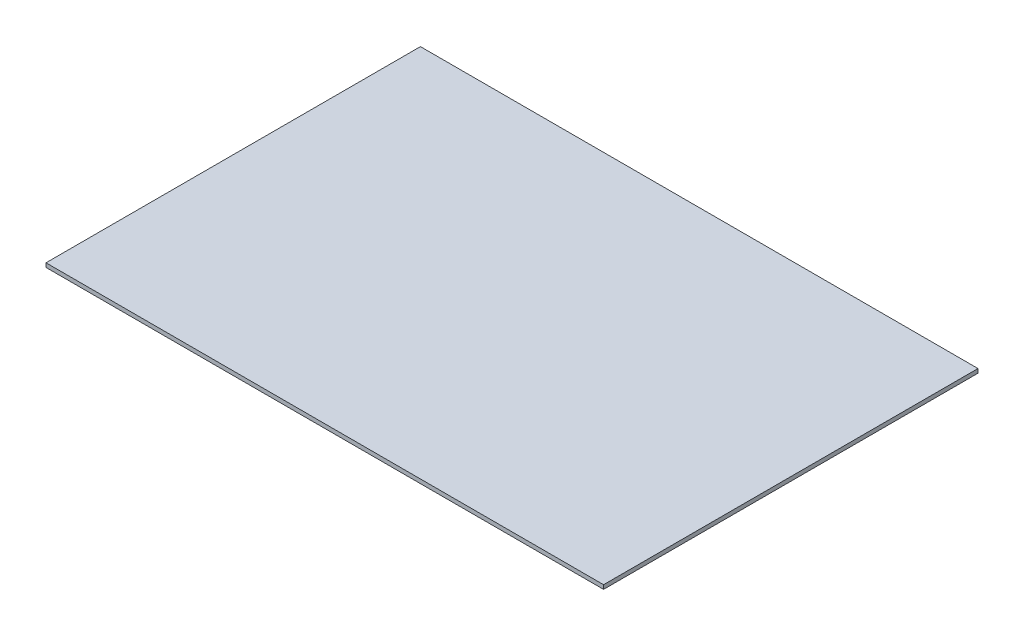
ISO-10303-21;
HEADER;
FILE_DESCRIPTION(('STEP AP214'),'2;1');
FILE_NAME('part.step','',(''),(''),'','','');
FILE_SCHEMA(('AUTOMOTIVE_DESIGN { 1 0 10303 214 1 1 1 1 }'));
ENDSEC;
DATA;
#1=APPLICATION_CONTEXT('core data for automotive mechanical design processes');
#2=APPLICATION_PROTOCOL_DEFINITION('international standard','automotive_design',2000,#1);
#3=PRODUCT_CONTEXT('',#1,'mechanical');
#4=PRODUCT('Part','Part','',(#3));
#5=PRODUCT_RELATED_PRODUCT_CATEGORY('part','',(#4));
#6=PRODUCT_DEFINITION_FORMATION('','',#4);
#7=PRODUCT_DEFINITION_CONTEXT('part definition',#1,'design');
#8=PRODUCT_DEFINITION('design','',#6,#7);
#9=PRODUCT_DEFINITION_SHAPE('','',#8);
#10=(LENGTH_UNIT() NAMED_UNIT(*) SI_UNIT(.MILLI.,.METRE.));
#11=(NAMED_UNIT(*) PLANE_ANGLE_UNIT() SI_UNIT($,.RADIAN.));
#12=(NAMED_UNIT(*) SI_UNIT($,.STERADIAN.) SOLID_ANGLE_UNIT());
#13=UNCERTAINTY_MEASURE_WITH_UNIT(LENGTH_MEASURE(1.E-05),#10,'distance_accuracy_value','');
#14=(GEOMETRIC_REPRESENTATION_CONTEXT(3) GLOBAL_UNCERTAINTY_ASSIGNED_CONTEXT((#13)) GLOBAL_UNIT_ASSIGNED_CONTEXT((#10,
#11,#12)) REPRESENTATION_CONTEXT('',''));
#15=CARTESIAN_POINT('',(0.,0.,0.));
#16=DIRECTION('',(0.,0.,1.));
#17=DIRECTION('',(1.,0.,0.));
#18=AXIS2_PLACEMENT_3D('',#15,#16,#17);
#19=CARTESIAN_POINT('',(137.,1.,-92.));
#20=DIRECTION('',(-1.,0.,0.));
#21=DIRECTION('',(0.,0.,1.));
#22=AXIS2_PLACEMENT_3D('',#19,#20,#21);
#23=PLANE('',#22);
#24=DIRECTION('',(0.,0.,-1.));
#25=VECTOR('',#24,1.);
#26=CARTESIAN_POINT('',(137.,-1.,-92.));
#27=LINE('',#26,#25);
#28=CARTESIAN_POINT('',(137.,-1.,92.));
#29=VERTEX_POINT('',#28);
#30=CARTESIAN_POINT('',(137.,-1.,-92.));
#31=VERTEX_POINT('',#30);
#32=EDGE_CURVE('E111',#29,#31,#27,.T.);
#33=ORIENTED_EDGE('',*,*,#32,.T.);
#34=DIRECTION('',(0.,-1.,0.));
#35=VECTOR('',#34,1.);
#36=CARTESIAN_POINT('',(137.,1.,-92.));
#37=LINE('',#36,#35);
#38=CARTESIAN_POINT('',(137.,1.,-92.));
#39=VERTEX_POINT('',#38);
#40=EDGE_CURVE('E11',#39,#31,#37,.T.);
#41=ORIENTED_EDGE('',*,*,#40,.F.);
#42=DIRECTION('',(0.,0.,-1.));
#43=VECTOR('',#42,1.);
#44=CARTESIAN_POINT('',(137.,1.,-92.));
#45=LINE('',#44,#43);
#46=CARTESIAN_POINT('',(137.,1.,92.));
#47=VERTEX_POINT('',#46);
#48=EDGE_CURVE('E95',#47,#39,#45,.T.);
#49=ORIENTED_EDGE('',*,*,#48,.F.);
#50=DIRECTION('',(0.,-1.,0.));
#51=VECTOR('',#50,1.);
#52=CARTESIAN_POINT('',(137.,1.,92.));
#53=LINE('',#52,#51);
#54=EDGE_CURVE('E107',#47,#29,#53,.T.);
#55=ORIENTED_EDGE('',*,*,#54,.T.);
#56=EDGE_LOOP('',(#33,#41,#49,#55));
#57=FACE_BOUND('',#56,.T.);
#58=ADVANCED_FACE('F43',(#57),#23,.F.);
#59=CARTESIAN_POINT('',(-137.,1.,-92.));
#60=DIRECTION('',(0.,0.,1.));
#61=DIRECTION('',(1.,0.,0.));
#62=AXIS2_PLACEMENT_3D('',#59,#60,#61);
#63=PLANE('',#62);
#64=DIRECTION('',(-1.,0.,0.));
#65=VECTOR('',#64,1.);
#66=CARTESIAN_POINT('',(-137.,-1.,-92.));
#67=LINE('',#66,#65);
#68=CARTESIAN_POINT('',(-137.,-1.,-92.));
#69=VERTEX_POINT('',#68);
#70=EDGE_CURVE('E100',#31,#69,#67,.T.);
#71=ORIENTED_EDGE('',*,*,#70,.T.);
#72=DIRECTION('',(0.,-1.,0.));
#73=VECTOR('',#72,1.);
#74=CARTESIAN_POINT('',(-137.,1.,-92.));
#75=LINE('',#74,#73);
#76=CARTESIAN_POINT('',(-137.,1.,-92.));
#77=VERTEX_POINT('',#76);
#78=EDGE_CURVE('E52',#77,#69,#75,.T.);
#79=ORIENTED_EDGE('',*,*,#78,.F.);
#80=DIRECTION('',(-1.,0.,0.));
#81=VECTOR('',#80,1.);
#82=CARTESIAN_POINT('',(-137.,1.,-92.));
#83=LINE('',#82,#81);
#84=EDGE_CURVE('E90',#39,#77,#83,.T.);
#85=ORIENTED_EDGE('',*,*,#84,.F.);
#86=ORIENTED_EDGE('',*,*,#40,.T.);
#87=EDGE_LOOP('',(#71,#79,#85,#86));
#88=FACE_BOUND('',#87,.T.);
#89=ADVANCED_FACE('F99',(#88),#63,.F.);
#90=CARTESIAN_POINT('',(-137.,1.,-92.));
#91=DIRECTION('',(1.,0.,0.));
#92=DIRECTION('',(0.,0.,-1.));
#93=AXIS2_PLACEMENT_3D('',#90,#91,#92);
#94=PLANE('',#93);
#95=DIRECTION('',(0.,0.,1.));
#96=VECTOR('',#95,1.);
#97=CARTESIAN_POINT('',(-137.,-1.,-92.));
#98=LINE('',#97,#96);
#99=CARTESIAN_POINT('',(-137.,-1.,92.));
#100=VERTEX_POINT('',#99);
#101=EDGE_CURVE('E77',#69,#100,#98,.T.);
#102=ORIENTED_EDGE('',*,*,#101,.T.);
#103=DIRECTION('',(0.,-1.,0.));
#104=VECTOR('',#103,1.);
#105=CARTESIAN_POINT('',(-137.,1.,92.));
#106=LINE('',#105,#104);
#107=CARTESIAN_POINT('',(-137.,1.,92.));
#108=VERTEX_POINT('',#107);
#109=EDGE_CURVE('E102',#108,#100,#106,.T.);
#110=ORIENTED_EDGE('',*,*,#109,.F.);
#111=DIRECTION('',(0.,0.,1.));
#112=VECTOR('',#111,1.);
#113=CARTESIAN_POINT('',(-137.,1.,-92.));
#114=LINE('',#113,#112);
#115=EDGE_CURVE('E93',#77,#108,#114,.T.);
#116=ORIENTED_EDGE('',*,*,#115,.F.);
#117=ORIENTED_EDGE('',*,*,#78,.T.);
#118=EDGE_LOOP('',(#102,#110,#116,#117));
#119=FACE_BOUND('',#118,.T.);
#120=ADVANCED_FACE('F103',(#119),#94,.F.);
#121=CARTESIAN_POINT('',(-137.,1.,92.));
#122=DIRECTION('',(0.,0.,-1.));
#123=DIRECTION('',(-1.,0.,0.));
#124=AXIS2_PLACEMENT_3D('',#121,#122,#123);
#125=PLANE('',#124);
#126=DIRECTION('',(1.,0.,0.));
#127=VECTOR('',#126,1.);
#128=CARTESIAN_POINT('',(-137.,-1.,92.));
#129=LINE('',#128,#127);
#130=EDGE_CURVE('E83',#100,#29,#129,.T.);
#131=ORIENTED_EDGE('',*,*,#130,.T.);
#132=ORIENTED_EDGE('',*,*,#54,.F.);
#133=DIRECTION('',(1.,0.,0.));
#134=VECTOR('',#133,1.);
#135=CARTESIAN_POINT('',(-137.,1.,92.));
#136=LINE('',#135,#134);
#137=EDGE_CURVE('E60',#108,#47,#136,.T.);
#138=ORIENTED_EDGE('',*,*,#137,.F.);
#139=ORIENTED_EDGE('',*,*,#109,.T.);
#140=EDGE_LOOP('',(#131,#132,#138,#139));
#141=FACE_BOUND('',#140,.T.);
#142=ADVANCED_FACE('F124',(#141),#125,.F.);
#143=CARTESIAN_POINT('',(0.,1.,0.));
#144=DIRECTION('',(0.,1.,0.));
#145=DIRECTION('',(0.,0.,1.));
#146=AXIS2_PLACEMENT_3D('',#143,#144,#145);
#147=PLANE('',#146);
#148=ORIENTED_EDGE('',*,*,#48,.T.);
#149=ORIENTED_EDGE('',*,*,#84,.T.);
#150=ORIENTED_EDGE('',*,*,#115,.T.);
#151=ORIENTED_EDGE('',*,*,#137,.T.);
#152=EDGE_LOOP('',(#148,#149,#150,#151));
#153=FACE_BOUND('',#152,.T.);
#154=ADVANCED_FACE('F91',(#153),#147,.T.);
#155=CARTESIAN_POINT('',(0.,-1.,0.));
#156=DIRECTION('',(0.,1.,0.));
#157=DIRECTION('',(0.,0.,1.));
#158=AXIS2_PLACEMENT_3D('',#155,#156,#157);
#159=PLANE('',#158);
#160=ORIENTED_EDGE('',*,*,#32,.F.);
#161=ORIENTED_EDGE('',*,*,#130,.F.);
#162=ORIENTED_EDGE('',*,*,#101,.F.);
#163=ORIENTED_EDGE('',*,*,#70,.F.);
#164=EDGE_LOOP('',(#160,#161,#162,#163));
#165=FACE_BOUND('',#164,.T.);
#166=ADVANCED_FACE('F127',(#165),#159,.F.);
#167=CLOSED_SHELL('',(#58,#89,#120,#142,#154,#166));
#168=MANIFOLD_SOLID_BREP('B2',#167);
#169=ADVANCED_BREP_SHAPE_REPRESENTATION('',(#18,#168),#14);
#170=SHAPE_DEFINITION_REPRESENTATION(#9,#169);
ENDSEC;
END-ISO-10303-21;
